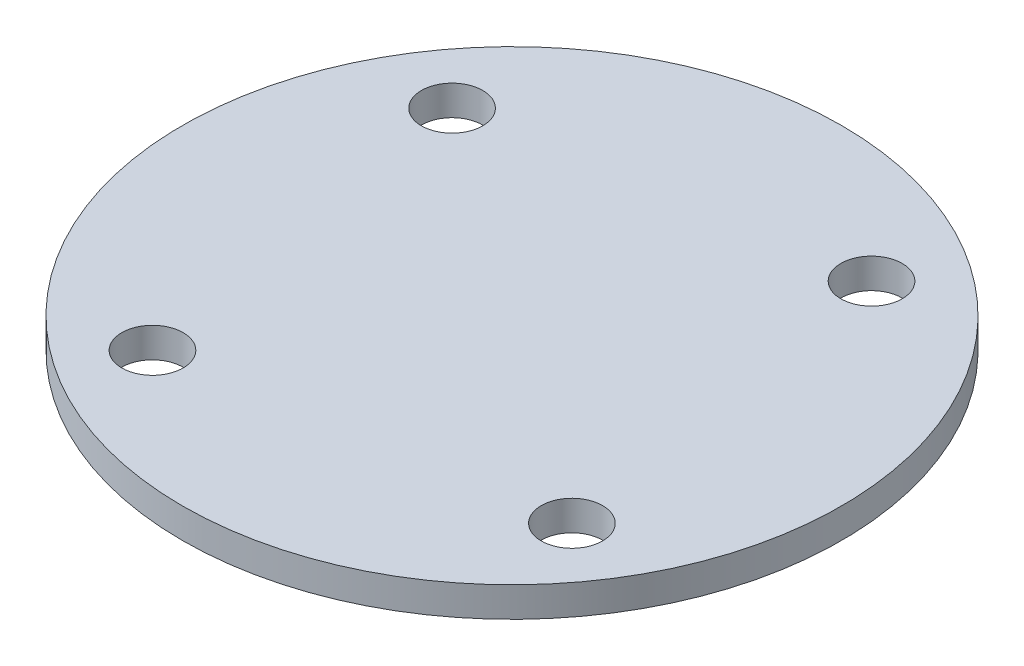
ISO-10303-21;
HEADER;
FILE_DESCRIPTION(('STEP AP214'),'2;1');
FILE_NAME('part.step','',(''),(''),'','','');
FILE_SCHEMA(('AUTOMOTIVE_DESIGN { 1 0 10303 214 1 1 1 1 }'));
ENDSEC;
DATA;
#1=APPLICATION_CONTEXT('core data for automotive mechanical design processes');
#2=APPLICATION_PROTOCOL_DEFINITION('international standard','automotive_design',2000,#1);
#3=PRODUCT_CONTEXT('',#1,'mechanical');
#4=PRODUCT('Part','Part','',(#3));
#5=PRODUCT_RELATED_PRODUCT_CATEGORY('part','',(#4));
#6=PRODUCT_DEFINITION_FORMATION('','',#4);
#7=PRODUCT_DEFINITION_CONTEXT('part definition',#1,'design');
#8=PRODUCT_DEFINITION('design','',#6,#7);
#9=PRODUCT_DEFINITION_SHAPE('','',#8);
#10=(LENGTH_UNIT() NAMED_UNIT(*) SI_UNIT(.MILLI.,.METRE.));
#11=(NAMED_UNIT(*) PLANE_ANGLE_UNIT() SI_UNIT($,.RADIAN.));
#12=(NAMED_UNIT(*) SI_UNIT($,.STERADIAN.) SOLID_ANGLE_UNIT());
#13=UNCERTAINTY_MEASURE_WITH_UNIT(LENGTH_MEASURE(1.E-05),#10,'distance_accuracy_value','');
#14=(GEOMETRIC_REPRESENTATION_CONTEXT(3) GLOBAL_UNCERTAINTY_ASSIGNED_CONTEXT((#13)) GLOBAL_UNIT_ASSIGNED_CONTEXT((#10,
#11,#12)) REPRESENTATION_CONTEXT('',''));
#15=CARTESIAN_POINT('',(0.,0.,0.));
#16=DIRECTION('',(0.,0.,1.));
#17=DIRECTION('',(1.,0.,0.));
#18=AXIS2_PLACEMENT_3D('',#15,#16,#17);
#19=CARTESIAN_POINT('',(0.,2.54,0.));
#20=DIRECTION('',(0.,-1.,0.));
#21=DIRECTION('',(0.,0.,-1.));
#22=AXIS2_PLACEMENT_3D('',#19,#20,#21);
#23=CYLINDRICAL_SURFACE('',#22,27.94);
#24=CARTESIAN_POINT('',(0.,2.54,0.));
#25=DIRECTION('',(0.,1.,0.));
#26=DIRECTION('',(0.,0.,1.));
#27=AXIS2_PLACEMENT_3D('',#24,#25,#26);
#28=CIRCLE('',#27,27.94);
#29=CARTESIAN_POINT('',(0.,2.54,27.94));
#30=VERTEX_POINT('',#29);
#31=EDGE_CURVE('E10',#30,#30,#28,.T.);
#32=ORIENTED_EDGE('',*,*,#31,.F.);
#33=EDGE_LOOP('',(#32));
#34=FACE_BOUND('',#33,.T.);
#35=CARTESIAN_POINT('',(0.,0.,0.));
#36=DIRECTION('',(0.,1.,0.));
#37=DIRECTION('',(0.,0.,1.));
#38=AXIS2_PLACEMENT_3D('',#35,#36,#37);
#39=CIRCLE('',#38,27.94);
#40=CARTESIAN_POINT('',(0.,0.,27.94));
#41=VERTEX_POINT('',#40);
#42=EDGE_CURVE('E42',#41,#41,#39,.T.);
#43=ORIENTED_EDGE('',*,*,#42,.T.);
#44=EDGE_LOOP('',(#43));
#45=FACE_BOUND('',#44,.T.);
#46=ADVANCED_FACE('F41',(#34,#45),#23,.T.);
#47=CARTESIAN_POINT('',(0.,2.54,0.));
#48=DIRECTION('',(0.,1.,0.));
#49=DIRECTION('',(0.,0.,1.));
#50=AXIS2_PLACEMENT_3D('',#47,#48,#49);
#51=PLANE('',#50);
#52=CARTESIAN_POINT('',(17.78,2.54,12.6999999999999));
#53=DIRECTION('',(0.,1.,0.));
#54=DIRECTION('',(1.,0.,0.));
#55=AXIS2_PLACEMENT_3D('',#52,#53,#54);
#56=CIRCLE('',#55,2.6);
#57=CARTESIAN_POINT('',(20.38,2.54,12.6999999999999));
#58=VERTEX_POINT('',#57);
#59=EDGE_CURVE('E72',#58,#58,#56,.T.);
#60=ORIENTED_EDGE('',*,*,#59,.F.);
#61=EDGE_LOOP('',(#60));
#62=FACE_BOUND('',#61,.T.);
#63=CARTESIAN_POINT('',(12.7,2.54,-17.78));
#64=DIRECTION('',(0.,1.,0.));
#65=DIRECTION('',(0.,0.,-1.));
#66=AXIS2_PLACEMENT_3D('',#63,#64,#65);
#67=CIRCLE('',#66,2.6);
#68=CARTESIAN_POINT('',(12.7,2.54,-20.38));
#69=VERTEX_POINT('',#68);
#70=EDGE_CURVE('E62',#69,#69,#67,.T.);
#71=ORIENTED_EDGE('',*,*,#70,.F.);
#72=EDGE_LOOP('',(#71));
#73=FACE_BOUND('',#72,.T.);
#74=CARTESIAN_POINT('',(-17.7800000000001,2.54,-12.6999999999998));
#75=DIRECTION('',(0.,1.,0.));
#76=DIRECTION('',(-1.,0.,0.));
#77=AXIS2_PLACEMENT_3D('',#74,#75,#76);
#78=CIRCLE('',#77,2.6);
#79=CARTESIAN_POINT('',(-20.3800000000001,2.54,-12.6999999999998));
#80=VERTEX_POINT('',#79);
#81=EDGE_CURVE('E56',#80,#80,#78,.T.);
#82=ORIENTED_EDGE('',*,*,#81,.F.);
#83=EDGE_LOOP('',(#82));
#84=FACE_BOUND('',#83,.T.);
#85=CARTESIAN_POINT('',(-12.7,2.54,17.78));
#86=DIRECTION('',(0.,1.,0.));
#87=DIRECTION('',(0.,0.,1.));
#88=AXIS2_PLACEMENT_3D('',#85,#86,#87);
#89=CIRCLE('',#88,2.6);
#90=CARTESIAN_POINT('',(-12.7,2.54,20.38));
#91=VERTEX_POINT('',#90);
#92=EDGE_CURVE('E52',#91,#91,#89,.T.);
#93=ORIENTED_EDGE('',*,*,#92,.F.);
#94=EDGE_LOOP('',(#93));
#95=FACE_BOUND('',#94,.T.);
#96=ORIENTED_EDGE('',*,*,#31,.T.);
#97=EDGE_LOOP('',(#96));
#98=FACE_BOUND('',#97,.T.);
#99=ADVANCED_FACE('F87',(#62,#73,#84,#95,#98),#51,.T.);
#100=CARTESIAN_POINT('',(0.,0.,0.));
#101=DIRECTION('',(0.,1.,0.));
#102=DIRECTION('',(0.,0.,1.));
#103=AXIS2_PLACEMENT_3D('',#100,#101,#102);
#104=PLANE('',#103);
#105=CARTESIAN_POINT('',(17.78,0.,12.6999999999999));
#106=DIRECTION('',(0.,1.,0.));
#107=DIRECTION('',(1.,0.,0.));
#108=AXIS2_PLACEMENT_3D('',#105,#106,#107);
#109=CIRCLE('',#108,2.6);
#110=CARTESIAN_POINT('',(20.38,0.,12.6999999999999));
#111=VERTEX_POINT('',#110);
#112=EDGE_CURVE('E57',#111,#111,#109,.T.);
#113=ORIENTED_EDGE('',*,*,#112,.T.);
#114=EDGE_LOOP('',(#113));
#115=FACE_BOUND('',#114,.T.);
#116=CARTESIAN_POINT('',(12.7,0.,-17.78));
#117=DIRECTION('',(0.,1.,0.));
#118=DIRECTION('',(0.,0.,-1.));
#119=AXIS2_PLACEMENT_3D('',#116,#117,#118);
#120=CIRCLE('',#119,2.6);
#121=CARTESIAN_POINT('',(12.7,0.,-20.38));
#122=VERTEX_POINT('',#121);
#123=EDGE_CURVE('E66',#122,#122,#120,.T.);
#124=ORIENTED_EDGE('',*,*,#123,.T.);
#125=EDGE_LOOP('',(#124));
#126=FACE_BOUND('',#125,.T.);
#127=CARTESIAN_POINT('',(-17.7800000000001,0.,-12.6999999999998));
#128=DIRECTION('',(0.,1.,0.));
#129=DIRECTION('',(-1.,0.,0.));
#130=AXIS2_PLACEMENT_3D('',#127,#128,#129);
#131=CIRCLE('',#130,2.6);
#132=CARTESIAN_POINT('',(-20.3800000000001,0.,-12.6999999999998));
#133=VERTEX_POINT('',#132);
#134=EDGE_CURVE('E61',#133,#133,#131,.T.);
#135=ORIENTED_EDGE('',*,*,#134,.T.);
#136=EDGE_LOOP('',(#135));
#137=FACE_BOUND('',#136,.T.);
#138=CARTESIAN_POINT('',(-12.7,0.,17.78));
#139=DIRECTION('',(0.,1.,0.));
#140=DIRECTION('',(0.,0.,1.));
#141=AXIS2_PLACEMENT_3D('',#138,#139,#140);
#142=CIRCLE('',#141,2.6);
#143=CARTESIAN_POINT('',(-12.7,0.,20.38));
#144=VERTEX_POINT('',#143);
#145=EDGE_CURVE('E51',#144,#144,#142,.T.);
#146=ORIENTED_EDGE('',*,*,#145,.T.);
#147=EDGE_LOOP('',(#146));
#148=FACE_BOUND('',#147,.T.);
#149=ORIENTED_EDGE('',*,*,#42,.F.);
#150=EDGE_LOOP('',(#149));
#151=FACE_BOUND('',#150,.T.);
#152=ADVANCED_FACE('F76',(#115,#126,#137,#148,#151),#104,.F.);
#153=CARTESIAN_POINT('',(-12.7,0.,17.78));
#154=DIRECTION('',(0.,1.,0.));
#155=DIRECTION('',(0.,0.,1.));
#156=AXIS2_PLACEMENT_3D('',#153,#154,#155);
#157=CYLINDRICAL_SURFACE('',#156,2.6);
#158=ORIENTED_EDGE('',*,*,#145,.F.);
#159=EDGE_LOOP('',(#158));
#160=FACE_BOUND('',#159,.T.);
#161=ORIENTED_EDGE('',*,*,#92,.T.);
#162=EDGE_LOOP('',(#161));
#163=FACE_BOUND('',#162,.T.);
#164=ADVANCED_FACE('F100',(#160,#163),#157,.F.);
#165=CARTESIAN_POINT('',(-17.7800000000001,0.,-12.6999999999998));
#166=DIRECTION('',(0.,1.,0.));
#167=DIRECTION('',(0.,0.,1.));
#168=AXIS2_PLACEMENT_3D('',#165,#166,#167);
#169=CYLINDRICAL_SURFACE('',#168,2.6);
#170=ORIENTED_EDGE('',*,*,#134,.F.);
#171=EDGE_LOOP('',(#170));
#172=FACE_BOUND('',#171,.T.);
#173=ORIENTED_EDGE('',*,*,#81,.T.);
#174=EDGE_LOOP('',(#173));
#175=FACE_BOUND('',#174,.T.);
#176=ADVANCED_FACE('F97',(#172,#175),#169,.F.);
#177=CARTESIAN_POINT('',(12.7,0.,-17.78));
#178=DIRECTION('',(0.,1.,0.));
#179=DIRECTION('',(0.,0.,1.));
#180=AXIS2_PLACEMENT_3D('',#177,#178,#179);
#181=CYLINDRICAL_SURFACE('',#180,2.6);
#182=ORIENTED_EDGE('',*,*,#123,.F.);
#183=EDGE_LOOP('',(#182));
#184=FACE_BOUND('',#183,.T.);
#185=ORIENTED_EDGE('',*,*,#70,.T.);
#186=EDGE_LOOP('',(#185));
#187=FACE_BOUND('',#186,.T.);
#188=ADVANCED_FACE('F81',(#184,#187),#181,.F.);
#189=CARTESIAN_POINT('',(17.78,0.,12.6999999999999));
#190=DIRECTION('',(0.,1.,0.));
#191=DIRECTION('',(0.,0.,1.));
#192=AXIS2_PLACEMENT_3D('',#189,#190,#191);
#193=CYLINDRICAL_SURFACE('',#192,2.6);
#194=ORIENTED_EDGE('',*,*,#112,.F.);
#195=EDGE_LOOP('',(#194));
#196=FACE_BOUND('',#195,.T.);
#197=ORIENTED_EDGE('',*,*,#59,.T.);
#198=EDGE_LOOP('',(#197));
#199=FACE_BOUND('',#198,.T.);
#200=ADVANCED_FACE('F77',(#196,#199),#193,.F.);
#201=CLOSED_SHELL('',(#46,#99,#152,#164,#176,#188,#200));
#202=MANIFOLD_SOLID_BREP('B2',#201);
#203=ADVANCED_BREP_SHAPE_REPRESENTATION('',(#18,#202),#14);
#204=SHAPE_DEFINITION_REPRESENTATION(#9,#203);
ENDSEC;
END-ISO-10303-21;
